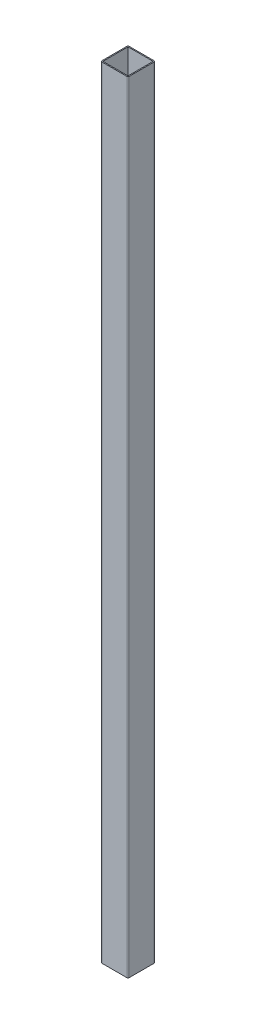
ISO-10303-21;
HEADER;
FILE_DESCRIPTION(('STEP AP214'),'2;1');
FILE_NAME('part.step','',(''),(''),'','','');
FILE_SCHEMA(('AUTOMOTIVE_DESIGN { 1 0 10303 214 1 1 1 1 }'));
ENDSEC;
DATA;
#1=APPLICATION_CONTEXT('core data for automotive mechanical design processes');
#2=APPLICATION_PROTOCOL_DEFINITION('international standard','automotive_design',2000,#1);
#3=PRODUCT_CONTEXT('',#1,'mechanical');
#4=PRODUCT('Part','Part','',(#3));
#5=PRODUCT_RELATED_PRODUCT_CATEGORY('part','',(#4));
#6=PRODUCT_DEFINITION_FORMATION('','',#4);
#7=PRODUCT_DEFINITION_CONTEXT('part definition',#1,'design');
#8=PRODUCT_DEFINITION('design','',#6,#7);
#9=PRODUCT_DEFINITION_SHAPE('','',#8);
#10=(LENGTH_UNIT() NAMED_UNIT(*) SI_UNIT(.MILLI.,.METRE.));
#11=(NAMED_UNIT(*) PLANE_ANGLE_UNIT() SI_UNIT($,.RADIAN.));
#12=(NAMED_UNIT(*) SI_UNIT($,.STERADIAN.) SOLID_ANGLE_UNIT());
#13=UNCERTAINTY_MEASURE_WITH_UNIT(LENGTH_MEASURE(1.E-05),#10,'distance_accuracy_value','');
#14=(GEOMETRIC_REPRESENTATION_CONTEXT(3) GLOBAL_UNCERTAINTY_ASSIGNED_CONTEXT((#13)) GLOBAL_UNIT_ASSIGNED_CONTEXT((#10,
#11,#12)) REPRESENTATION_CONTEXT('',''));
#15=CARTESIAN_POINT('',(0.,0.,0.));
#16=DIRECTION('',(0.,0.,1.));
#17=DIRECTION('',(1.,0.,0.));
#18=AXIS2_PLACEMENT_3D('',#15,#16,#17);
#19=CARTESIAN_POINT('',(73.9990000000006,-4593.,73.999));
#20=DIRECTION('',(0.,1.,0.));
#21=DIRECTION('',(-1.,0.,0.));
#22=AXIS2_PLACEMENT_3D('',#19,#20,#21);
#23=CYLINDRICAL_SURFACE('',#22,6.00100000000001);
#24=CARTESIAN_POINT('',(73.999,0.,73.999));
#25=DIRECTION('',(0.,-1.,0.));
#26=DIRECTION('',(1.,0.,0.));
#27=AXIS2_PLACEMENT_3D('',#24,#25,#26);
#28=CIRCLE('',#27,6.00100000000001);
#29=CARTESIAN_POINT('',(80.,0.,73.999));
#30=VERTEX_POINT('',#29);
#31=CARTESIAN_POINT('',(73.999,0.,80.));
#32=VERTEX_POINT('',#31);
#33=EDGE_CURVE('E232',#30,#32,#28,.T.);
#34=ORIENTED_EDGE('',*,*,#33,.T.);
#35=DIRECTION('',(0.,1.,0.));
#36=VECTOR('',#35,1.);
#37=CARTESIAN_POINT('',(73.9990000000006,-4593.,80.));
#38=LINE('',#37,#36);
#39=CARTESIAN_POINT('',(73.9990000000006,-4593.,80.));
#40=VERTEX_POINT('',#39);
#41=EDGE_CURVE('E12',#40,#32,#38,.T.);
#42=ORIENTED_EDGE('',*,*,#41,.F.);
#43=CARTESIAN_POINT('',(73.9990000000006,-4593.,73.999));
#44=DIRECTION('',(0.,-1.,0.));
#45=DIRECTION('',(1.,0.,0.));
#46=AXIS2_PLACEMENT_3D('',#43,#44,#45);
#47=CIRCLE('',#46,6.00100000000001);
#48=CARTESIAN_POINT('',(80.0000000000006,-4593.,73.999));
#49=VERTEX_POINT('',#48);
#50=EDGE_CURVE('E310',#49,#40,#47,.T.);
#51=ORIENTED_EDGE('',*,*,#50,.F.);
#52=DIRECTION('',(0.,1.,0.));
#53=VECTOR('',#52,1.);
#54=CARTESIAN_POINT('',(80.0000000000006,-4593.,73.999));
#55=LINE('',#54,#53);
#56=EDGE_CURVE('E247',#49,#30,#55,.T.);
#57=ORIENTED_EDGE('',*,*,#56,.T.);
#58=EDGE_LOOP('',(#34,#42,#51,#57));
#59=FACE_BOUND('',#58,.T.);
#60=ADVANCED_FACE('F60',(#59),#23,.T.);
#61=CARTESIAN_POINT('',(73.9990000000006,-4593.,80.));
#62=DIRECTION('',(0.,0.,-1.));
#63=DIRECTION('',(-1.,0.,0.));
#64=AXIS2_PLACEMENT_3D('',#61,#62,#63);
#65=PLANE('',#64);
#66=DIRECTION('',(-1.,0.,0.));
#67=VECTOR('',#66,1.);
#68=CARTESIAN_POINT('',(73.999,0.,80.));
#69=LINE('',#68,#67);
#70=CARTESIAN_POINT('',(-73.999,0.,80.));
#71=VERTEX_POINT('',#70);
#72=EDGE_CURVE('E235',#32,#71,#69,.T.);
#73=ORIENTED_EDGE('',*,*,#72,.T.);
#74=DIRECTION('',(0.,1.,0.));
#75=VECTOR('',#74,1.);
#76=CARTESIAN_POINT('',(-73.9989999999995,-4593.,80.));
#77=LINE('',#76,#75);
#78=CARTESIAN_POINT('',(-73.9989999999995,-4593.,80.));
#79=VERTEX_POINT('',#78);
#80=EDGE_CURVE('E70',#79,#71,#77,.T.);
#81=ORIENTED_EDGE('',*,*,#80,.F.);
#82=DIRECTION('',(-1.,0.,0.));
#83=VECTOR('',#82,1.);
#84=CARTESIAN_POINT('',(73.9990000000006,-4593.,80.));
#85=LINE('',#84,#83);
#86=EDGE_CURVE('E312',#40,#79,#85,.T.);
#87=ORIENTED_EDGE('',*,*,#86,.F.);
#88=ORIENTED_EDGE('',*,*,#41,.T.);
#89=EDGE_LOOP('',(#73,#81,#87,#88));
#90=FACE_BOUND('',#89,.T.);
#91=ADVANCED_FACE('F347',(#90),#65,.F.);
#92=CARTESIAN_POINT('',(-73.9989999999994,-4593.,73.999));
#93=DIRECTION('',(0.,1.,0.));
#94=DIRECTION('',(-1.,0.,0.));
#95=AXIS2_PLACEMENT_3D('',#92,#93,#94);
#96=CYLINDRICAL_SURFACE('',#95,6.00100000000001);
#97=CARTESIAN_POINT('',(-73.999,0.,73.999));
#98=DIRECTION('',(0.,-1.,0.));
#99=DIRECTION('',(1.,0.,0.));
#100=AXIS2_PLACEMENT_3D('',#97,#98,#99);
#101=CIRCLE('',#100,6.00100000000001);
#102=CARTESIAN_POINT('',(-80.,0.,73.999));
#103=VERTEX_POINT('',#102);
#104=EDGE_CURVE('E237',#71,#103,#101,.T.);
#105=ORIENTED_EDGE('',*,*,#104,.T.);
#106=DIRECTION('',(0.,1.,0.));
#107=VECTOR('',#106,1.);
#108=CARTESIAN_POINT('',(-79.9999999999994,-4593.,73.999));
#109=LINE('',#108,#107);
#110=CARTESIAN_POINT('',(-79.9999999999994,-4593.,73.999));
#111=VERTEX_POINT('',#110);
#112=EDGE_CURVE('E254',#111,#103,#109,.T.);
#113=ORIENTED_EDGE('',*,*,#112,.F.);
#114=CARTESIAN_POINT('',(-73.9989999999994,-4593.,73.999));
#115=DIRECTION('',(0.,-1.,0.));
#116=DIRECTION('',(1.,0.,0.));
#117=AXIS2_PLACEMENT_3D('',#114,#115,#116);
#118=CIRCLE('',#117,6.00100000000001);
#119=EDGE_CURVE('E314',#79,#111,#118,.T.);
#120=ORIENTED_EDGE('',*,*,#119,.F.);
#121=ORIENTED_EDGE('',*,*,#80,.T.);
#122=EDGE_LOOP('',(#105,#113,#120,#121));
#123=FACE_BOUND('',#122,.T.);
#124=ADVANCED_FACE('F352',(#123),#96,.T.);
#125=CARTESIAN_POINT('',(-79.9999999999994,-4593.,-73.999));
#126=DIRECTION('',(1.,0.,0.));
#127=DIRECTION('',(0.,1.,0.));
#128=AXIS2_PLACEMENT_3D('',#125,#126,#127);
#129=PLANE('',#128);
#130=DIRECTION('',(0.,0.,-1.));
#131=VECTOR('',#130,1.);
#132=CARTESIAN_POINT('',(-80.,0.,-73.999));
#133=LINE('',#132,#131);
#134=CARTESIAN_POINT('',(-80.,0.,-73.999));
#135=VERTEX_POINT('',#134);
#136=EDGE_CURVE('E239',#103,#135,#133,.T.);
#137=ORIENTED_EDGE('',*,*,#136,.T.);
#138=DIRECTION('',(0.,1.,0.));
#139=VECTOR('',#138,1.);
#140=CARTESIAN_POINT('',(-79.9999999999994,-4593.,-73.999));
#141=LINE('',#140,#139);
#142=CARTESIAN_POINT('',(-79.9999999999994,-4593.,-73.999));
#143=VERTEX_POINT('',#142);
#144=EDGE_CURVE('E251',#143,#135,#141,.T.);
#145=ORIENTED_EDGE('',*,*,#144,.F.);
#146=DIRECTION('',(0.,0.,-1.));
#147=VECTOR('',#146,1.);
#148=CARTESIAN_POINT('',(-79.9999999999994,-4593.,-73.999));
#149=LINE('',#148,#147);
#150=EDGE_CURVE('E316',#111,#143,#149,.T.);
#151=ORIENTED_EDGE('',*,*,#150,.F.);
#152=ORIENTED_EDGE('',*,*,#112,.T.);
#153=EDGE_LOOP('',(#137,#145,#151,#152));
#154=FACE_BOUND('',#153,.T.);
#155=ADVANCED_FACE('F322',(#154),#129,.F.);
#156=CARTESIAN_POINT('',(-73.9989999999994,-4593.,-73.999));
#157=DIRECTION('',(0.,1.,0.));
#158=DIRECTION('',(-1.,0.,0.));
#159=AXIS2_PLACEMENT_3D('',#156,#157,#158);
#160=CYLINDRICAL_SURFACE('',#159,6.001);
#161=CARTESIAN_POINT('',(-73.999,0.,-73.999));
#162=DIRECTION('',(0.,-1.,0.));
#163=DIRECTION('',(1.,0.,0.));
#164=AXIS2_PLACEMENT_3D('',#161,#162,#163);
#165=CIRCLE('',#164,6.001);
#166=CARTESIAN_POINT('',(-73.999,0.,-80.));
#167=VERTEX_POINT('',#166);
#168=EDGE_CURVE('E241',#135,#167,#165,.T.);
#169=ORIENTED_EDGE('',*,*,#168,.T.);
#170=DIRECTION('',(0.,1.,0.));
#171=VECTOR('',#170,1.);
#172=CARTESIAN_POINT('',(-73.9989999999995,-4593.,-80.));
#173=LINE('',#172,#171);
#174=CARTESIAN_POINT('',(-73.9989999999995,-4593.,-80.));
#175=VERTEX_POINT('',#174);
#176=EDGE_CURVE('E199',#175,#167,#173,.T.);
#177=ORIENTED_EDGE('',*,*,#176,.F.);
#178=CARTESIAN_POINT('',(-73.9989999999994,-4593.,-73.999));
#179=DIRECTION('',(0.,-1.,0.));
#180=DIRECTION('',(1.,0.,0.));
#181=AXIS2_PLACEMENT_3D('',#178,#179,#180);
#182=CIRCLE('',#181,6.001);
#183=EDGE_CURVE('E190',#143,#175,#182,.T.);
#184=ORIENTED_EDGE('',*,*,#183,.F.);
#185=ORIENTED_EDGE('',*,*,#144,.T.);
#186=EDGE_LOOP('',(#169,#177,#184,#185));
#187=FACE_BOUND('',#186,.T.);
#188=ADVANCED_FACE('F326',(#187),#160,.T.);
#189=CARTESIAN_POINT('',(-73.9989999999995,-4593.,-80.));
#190=DIRECTION('',(0.,0.,1.));
#191=DIRECTION('',(1.,0.,0.));
#192=AXIS2_PLACEMENT_3D('',#189,#190,#191);
#193=PLANE('',#192);
#194=DIRECTION('',(1.,0.,0.));
#195=VECTOR('',#194,1.);
#196=CARTESIAN_POINT('',(-73.999,0.,-80.));
#197=LINE('',#196,#195);
#198=CARTESIAN_POINT('',(73.999,0.,-80.));
#199=VERTEX_POINT('',#198);
#200=EDGE_CURVE('E198',#167,#199,#197,.T.);
#201=ORIENTED_EDGE('',*,*,#200,.T.);
#202=DIRECTION('',(0.,1.,0.));
#203=VECTOR('',#202,1.);
#204=CARTESIAN_POINT('',(73.9990000000006,-4593.,-80.));
#205=LINE('',#204,#203);
#206=CARTESIAN_POINT('',(73.9990000000006,-4593.,-80.));
#207=VERTEX_POINT('',#206);
#208=EDGE_CURVE('E195',#207,#199,#205,.T.);
#209=ORIENTED_EDGE('',*,*,#208,.F.);
#210=DIRECTION('',(1.,0.,0.));
#211=VECTOR('',#210,1.);
#212=CARTESIAN_POINT('',(-73.9989999999995,-4593.,-80.));
#213=LINE('',#212,#211);
#214=EDGE_CURVE('E184',#175,#207,#213,.T.);
#215=ORIENTED_EDGE('',*,*,#214,.F.);
#216=ORIENTED_EDGE('',*,*,#176,.T.);
#217=EDGE_LOOP('',(#201,#209,#215,#216));
#218=FACE_BOUND('',#217,.T.);
#219=ADVANCED_FACE('F196',(#218),#193,.F.);
#220=CARTESIAN_POINT('',(73.9990000000006,-4593.,-73.999));
#221=DIRECTION('',(0.,1.,0.));
#222=DIRECTION('',(-1.,0.,0.));
#223=AXIS2_PLACEMENT_3D('',#220,#221,#222);
#224=CYLINDRICAL_SURFACE('',#223,6.001);
#225=CARTESIAN_POINT('',(73.999,0.,-73.999));
#226=DIRECTION('',(0.,-1.,0.));
#227=DIRECTION('',(1.,0.,0.));
#228=AXIS2_PLACEMENT_3D('',#225,#226,#227);
#229=CIRCLE('',#228,6.001);
#230=CARTESIAN_POINT('',(80.,0.,-73.999));
#231=VERTEX_POINT('',#230);
#232=EDGE_CURVE('E132',#199,#231,#229,.T.);
#233=ORIENTED_EDGE('',*,*,#232,.T.);
#234=DIRECTION('',(0.,1.,0.));
#235=VECTOR('',#234,1.);
#236=CARTESIAN_POINT('',(80.0000000000006,-4593.,-73.999));
#237=LINE('',#236,#235);
#238=CARTESIAN_POINT('',(80.0000000000006,-4593.,-73.999));
#239=VERTEX_POINT('',#238);
#240=EDGE_CURVE('E200',#239,#231,#237,.T.);
#241=ORIENTED_EDGE('',*,*,#240,.F.);
#242=CARTESIAN_POINT('',(73.9990000000006,-4593.,-73.999));
#243=DIRECTION('',(0.,-1.,0.));
#244=DIRECTION('',(1.,0.,0.));
#245=AXIS2_PLACEMENT_3D('',#242,#243,#244);
#246=CIRCLE('',#245,6.001);
#247=EDGE_CURVE('E188',#207,#239,#246,.T.);
#248=ORIENTED_EDGE('',*,*,#247,.F.);
#249=ORIENTED_EDGE('',*,*,#208,.T.);
#250=EDGE_LOOP('',(#233,#241,#248,#249));
#251=FACE_BOUND('',#250,.T.);
#252=ADVANCED_FACE('F202',(#251),#224,.T.);
#253=CARTESIAN_POINT('',(-73.9989999999994,-4593.,73.999));
#254=DIRECTION('',(0.,1.,0.));
#255=DIRECTION('',(-1.,0.,0.));
#256=AXIS2_PLACEMENT_3D('',#253,#254,#255);
#257=CYLINDRICAL_SURFACE('',#256,0.000999999999987122);
#258=CARTESIAN_POINT('',(-73.999,0.,73.999));
#259=DIRECTION('',(0.,-1.,0.));
#260=DIRECTION('',(1.,0.,0.));
#261=AXIS2_PLACEMENT_3D('',#258,#259,#260);
#262=CIRCLE('',#261,0.000999999999987122);
#263=CARTESIAN_POINT('',(-73.999,0.,74.));
#264=VERTEX_POINT('',#263);
#265=CARTESIAN_POINT('',(-74.,0.,73.999));
#266=VERTEX_POINT('',#265);
#267=EDGE_CURVE('E208',#264,#266,#262,.T.);
#268=ORIENTED_EDGE('',*,*,#267,.F.);
#269=DIRECTION('',(0.,1.,0.));
#270=VECTOR('',#269,1.);
#271=CARTESIAN_POINT('',(-73.9989999999994,-4593.,74.));
#272=LINE('',#271,#270);
#273=CARTESIAN_POINT('',(-73.9989999999994,-4593.,74.));
#274=VERTEX_POINT('',#273);
#275=EDGE_CURVE('E64',#274,#264,#272,.T.);
#276=ORIENTED_EDGE('',*,*,#275,.F.);
#277=CARTESIAN_POINT('',(-73.9989999999994,-4593.,73.999));
#278=DIRECTION('',(0.,-1.,0.));
#279=DIRECTION('',(1.,0.,0.));
#280=AXIS2_PLACEMENT_3D('',#277,#278,#279);
#281=CIRCLE('',#280,0.000999999999987122);
#282=CARTESIAN_POINT('',(-73.9999999999994,-4593.,73.999));
#283=VERTEX_POINT('',#282);
#284=EDGE_CURVE('E246',#274,#283,#281,.T.);
#285=ORIENTED_EDGE('',*,*,#284,.T.);
#286=DIRECTION('',(0.,1.,0.));
#287=VECTOR('',#286,1.);
#288=CARTESIAN_POINT('',(-73.9999999999994,-4593.,73.999));
#289=LINE('',#288,#287);
#290=EDGE_CURVE('E204',#283,#266,#289,.T.);
#291=ORIENTED_EDGE('',*,*,#290,.T.);
#292=EDGE_LOOP('',(#268,#276,#285,#291));
#293=FACE_BOUND('',#292,.T.);
#294=ADVANCED_FACE('F62',(#293),#257,.F.);
#295=CARTESIAN_POINT('',(73.9990000000006,-4593.,74.));
#296=DIRECTION('',(0.,0.,-1.));
#297=DIRECTION('',(-1.,0.,0.));
#298=AXIS2_PLACEMENT_3D('',#295,#296,#297);
#299=PLANE('',#298);
#300=DIRECTION('',(-1.,0.,0.));
#301=VECTOR('',#300,1.);
#302=CARTESIAN_POINT('',(73.999,0.,74.));
#303=LINE('',#302,#301);
#304=CARTESIAN_POINT('',(73.999,0.,74.));
#305=VERTEX_POINT('',#304);
#306=EDGE_CURVE('E211',#305,#264,#303,.T.);
#307=ORIENTED_EDGE('',*,*,#306,.F.);
#308=DIRECTION('',(0.,1.,0.));
#309=VECTOR('',#308,1.);
#310=CARTESIAN_POINT('',(73.9990000000006,-4593.,74.));
#311=LINE('',#310,#309);
#312=CARTESIAN_POINT('',(73.9990000000006,-4593.,74.));
#313=VERTEX_POINT('',#312);
#314=EDGE_CURVE('E269',#313,#305,#311,.T.);
#315=ORIENTED_EDGE('',*,*,#314,.F.);
#316=DIRECTION('',(-1.,0.,0.));
#317=VECTOR('',#316,1.);
#318=CARTESIAN_POINT('',(73.9990000000006,-4593.,74.));
#319=LINE('',#318,#317);
#320=EDGE_CURVE('E278',#313,#274,#319,.T.);
#321=ORIENTED_EDGE('',*,*,#320,.T.);
#322=ORIENTED_EDGE('',*,*,#275,.T.);
#323=EDGE_LOOP('',(#307,#315,#321,#322));
#324=FACE_BOUND('',#323,.T.);
#325=ADVANCED_FACE('F276',(#324),#299,.T.);
#326=CARTESIAN_POINT('',(73.9990000000006,-4593.,73.999));
#327=DIRECTION('',(0.,1.,0.));
#328=DIRECTION('',(-1.,0.,0.));
#329=AXIS2_PLACEMENT_3D('',#326,#327,#328);
#330=CYLINDRICAL_SURFACE('',#329,0.000999999999987122);
#331=CARTESIAN_POINT('',(73.999,0.,73.999));
#332=DIRECTION('',(0.,-1.,0.));
#333=DIRECTION('',(1.,0.,0.));
#334=AXIS2_PLACEMENT_3D('',#331,#332,#333);
#335=CIRCLE('',#334,0.000999999999987122);
#336=CARTESIAN_POINT('',(74.,0.,73.999));
#337=VERTEX_POINT('',#336);
#338=EDGE_CURVE('E214',#337,#305,#335,.T.);
#339=ORIENTED_EDGE('',*,*,#338,.F.);
#340=DIRECTION('',(0.,1.,0.));
#341=VECTOR('',#340,1.);
#342=CARTESIAN_POINT('',(74.0000000000006,-4593.,73.999));
#343=LINE('',#342,#341);
#344=CARTESIAN_POINT('',(74.0000000000006,-4593.,73.999));
#345=VERTEX_POINT('',#344);
#346=EDGE_CURVE('E268',#345,#337,#343,.T.);
#347=ORIENTED_EDGE('',*,*,#346,.F.);
#348=CARTESIAN_POINT('',(73.9990000000006,-4593.,73.999));
#349=DIRECTION('',(0.,-1.,0.));
#350=DIRECTION('',(1.,0.,0.));
#351=AXIS2_PLACEMENT_3D('',#348,#349,#350);
#352=CIRCLE('',#351,0.000999999999987122);
#353=EDGE_CURVE('E286',#345,#313,#352,.T.);
#354=ORIENTED_EDGE('',*,*,#353,.T.);
#355=ORIENTED_EDGE('',*,*,#314,.T.);
#356=EDGE_LOOP('',(#339,#347,#354,#355));
#357=FACE_BOUND('',#356,.T.);
#358=ADVANCED_FACE('F284',(#357),#330,.F.);
#359=CARTESIAN_POINT('',(74.0000000000006,-4593.,73.999));
#360=DIRECTION('',(-1.,0.,0.));
#361=DIRECTION('',(0.,-1.,0.));
#362=AXIS2_PLACEMENT_3D('',#359,#360,#361);
#363=PLANE('',#362);
#364=DIRECTION('',(0.,0.,1.));
#365=VECTOR('',#364,1.);
#366=CARTESIAN_POINT('',(74.,0.,73.999));
#367=LINE('',#366,#365);
#368=CARTESIAN_POINT('',(74.,0.,-73.999));
#369=VERTEX_POINT('',#368);
#370=EDGE_CURVE('E217',#369,#337,#367,.T.);
#371=ORIENTED_EDGE('',*,*,#370,.F.);
#372=DIRECTION('',(0.,1.,0.));
#373=VECTOR('',#372,1.);
#374=CARTESIAN_POINT('',(74.0000000000006,-4593.,-73.999));
#375=LINE('',#374,#373);
#376=CARTESIAN_POINT('',(74.0000000000006,-4593.,-73.999));
#377=VERTEX_POINT('',#376);
#378=EDGE_CURVE('E266',#377,#369,#375,.T.);
#379=ORIENTED_EDGE('',*,*,#378,.F.);
#380=DIRECTION('',(0.,0.,1.));
#381=VECTOR('',#380,1.);
#382=CARTESIAN_POINT('',(74.0000000000006,-4593.,73.999));
#383=LINE('',#382,#381);
#384=EDGE_CURVE('E292',#377,#345,#383,.T.);
#385=ORIENTED_EDGE('',*,*,#384,.T.);
#386=ORIENTED_EDGE('',*,*,#346,.T.);
#387=EDGE_LOOP('',(#371,#379,#385,#386));
#388=FACE_BOUND('',#387,.T.);
#389=ADVANCED_FACE('F295',(#388),#363,.T.);
#390=CARTESIAN_POINT('',(73.9990000000006,-4593.,-73.999));
#391=DIRECTION('',(0.,1.,0.));
#392=DIRECTION('',(-1.,0.,0.));
#393=AXIS2_PLACEMENT_3D('',#390,#391,#392);
#394=CYLINDRICAL_SURFACE('',#393,0.000999999999980183);
#395=CARTESIAN_POINT('',(73.999,0.,-73.999));
#396=DIRECTION('',(0.,-1.,0.));
#397=DIRECTION('',(1.,0.,0.));
#398=AXIS2_PLACEMENT_3D('',#395,#396,#397);
#399=CIRCLE('',#398,0.000999999999980183);
#400=CARTESIAN_POINT('',(73.999,0.,-74.));
#401=VERTEX_POINT('',#400);
#402=EDGE_CURVE('E220',#401,#369,#399,.T.);
#403=ORIENTED_EDGE('',*,*,#402,.F.);
#404=DIRECTION('',(0.,1.,0.));
#405=VECTOR('',#404,1.);
#406=CARTESIAN_POINT('',(73.9990000000006,-4593.,-74.));
#407=LINE('',#406,#405);
#408=CARTESIAN_POINT('',(73.9990000000006,-4593.,-74.));
#409=VERTEX_POINT('',#408);
#410=EDGE_CURVE('E264',#409,#401,#407,.T.);
#411=ORIENTED_EDGE('',*,*,#410,.F.);
#412=CARTESIAN_POINT('',(73.9990000000006,-4593.,-73.999));
#413=DIRECTION('',(0.,-1.,0.));
#414=DIRECTION('',(1.,0.,0.));
#415=AXIS2_PLACEMENT_3D('',#412,#413,#414);
#416=CIRCLE('',#415,0.000999999999980183);
#417=EDGE_CURVE('E296',#409,#377,#416,.T.);
#418=ORIENTED_EDGE('',*,*,#417,.T.);
#419=ORIENTED_EDGE('',*,*,#378,.T.);
#420=EDGE_LOOP('',(#403,#411,#418,#419));
#421=FACE_BOUND('',#420,.T.);
#422=ADVANCED_FACE('F363',(#421),#394,.F.);
#423=CARTESIAN_POINT('',(-73.9989999999994,-4593.,-74.));
#424=DIRECTION('',(0.,0.,1.));
#425=DIRECTION('',(1.,0.,0.));
#426=AXIS2_PLACEMENT_3D('',#423,#424,#425);
#427=PLANE('',#426);
#428=DIRECTION('',(1.,0.,0.));
#429=VECTOR('',#428,1.);
#430=CARTESIAN_POINT('',(-73.999,0.,-74.));
#431=LINE('',#430,#429);
#432=CARTESIAN_POINT('',(-73.999,0.,-74.));
#433=VERTEX_POINT('',#432);
#434=EDGE_CURVE('E223',#433,#401,#431,.T.);
#435=ORIENTED_EDGE('',*,*,#434,.F.);
#436=DIRECTION('',(0.,1.,0.));
#437=VECTOR('',#436,1.);
#438=CARTESIAN_POINT('',(-73.9989999999994,-4593.,-74.));
#439=LINE('',#438,#437);
#440=CARTESIAN_POINT('',(-73.9989999999994,-4593.,-74.));
#441=VERTEX_POINT('',#440);
#442=EDGE_CURVE('E262',#441,#433,#439,.T.);
#443=ORIENTED_EDGE('',*,*,#442,.F.);
#444=DIRECTION('',(1.,0.,0.));
#445=VECTOR('',#444,1.);
#446=CARTESIAN_POINT('',(-73.9989999999994,-4593.,-74.));
#447=LINE('',#446,#445);
#448=EDGE_CURVE('E298',#441,#409,#447,.T.);
#449=ORIENTED_EDGE('',*,*,#448,.T.);
#450=ORIENTED_EDGE('',*,*,#410,.T.);
#451=EDGE_LOOP('',(#435,#443,#449,#450));
#452=FACE_BOUND('',#451,.T.);
#453=ADVANCED_FACE('F359',(#452),#427,.T.);
#454=CARTESIAN_POINT('',(-73.9989999999994,-4593.,-73.999));
#455=DIRECTION('',(0.,1.,0.));
#456=DIRECTION('',(-1.,0.,0.));
#457=AXIS2_PLACEMENT_3D('',#454,#455,#456);
#458=CYLINDRICAL_SURFACE('',#457,0.000999999999980183);
#459=CARTESIAN_POINT('',(-73.999,0.,-73.999));
#460=DIRECTION('',(0.,-1.,0.));
#461=DIRECTION('',(1.,0.,0.));
#462=AXIS2_PLACEMENT_3D('',#459,#460,#461);
#463=CIRCLE('',#462,0.000999999999980183);
#464=CARTESIAN_POINT('',(-74.,0.,-73.999));
#465=VERTEX_POINT('',#464);
#466=EDGE_CURVE('E226',#465,#433,#463,.T.);
#467=ORIENTED_EDGE('',*,*,#466,.F.);
#468=DIRECTION('',(0.,1.,0.));
#469=VECTOR('',#468,1.);
#470=CARTESIAN_POINT('',(-73.9999999999994,-4593.,-73.999));
#471=LINE('',#470,#469);
#472=CARTESIAN_POINT('',(-73.9999999999994,-4593.,-73.999));
#473=VERTEX_POINT('',#472);
#474=EDGE_CURVE('E260',#473,#465,#471,.T.);
#475=ORIENTED_EDGE('',*,*,#474,.F.);
#476=CARTESIAN_POINT('',(-73.9989999999994,-4593.,-73.999));
#477=DIRECTION('',(0.,-1.,0.));
#478=DIRECTION('',(1.,0.,0.));
#479=AXIS2_PLACEMENT_3D('',#476,#477,#478);
#480=CIRCLE('',#479,0.000999999999980183);
#481=EDGE_CURVE('E304',#473,#441,#480,.T.);
#482=ORIENTED_EDGE('',*,*,#481,.T.);
#483=ORIENTED_EDGE('',*,*,#442,.T.);
#484=EDGE_LOOP('',(#467,#475,#482,#483));
#485=FACE_BOUND('',#484,.T.);
#486=ADVANCED_FACE('F341',(#485),#458,.F.);
#487=CARTESIAN_POINT('',(-73.9999999999994,-4593.,-73.999));
#488=DIRECTION('',(1.,0.,0.));
#489=DIRECTION('',(0.,1.,0.));
#490=AXIS2_PLACEMENT_3D('',#487,#488,#489);
#491=PLANE('',#490);
#492=DIRECTION('',(0.,0.,-1.));
#493=VECTOR('',#492,1.);
#494=CARTESIAN_POINT('',(-74.,0.,-73.999));
#495=LINE('',#494,#493);
#496=EDGE_CURVE('E229',#266,#465,#495,.T.);
#497=ORIENTED_EDGE('',*,*,#496,.F.);
#498=ORIENTED_EDGE('',*,*,#290,.F.);
#499=DIRECTION('',(0.,0.,-1.));
#500=VECTOR('',#499,1.);
#501=CARTESIAN_POINT('',(-73.9999999999994,-4593.,-73.999));
#502=LINE('',#501,#500);
#503=EDGE_CURVE('E307',#283,#473,#502,.T.);
#504=ORIENTED_EDGE('',*,*,#503,.T.);
#505=ORIENTED_EDGE('',*,*,#474,.T.);
#506=EDGE_LOOP('',(#497,#498,#504,#505));
#507=FACE_BOUND('',#506,.T.);
#508=ADVANCED_FACE('F334',(#507),#491,.T.);
#509=CARTESIAN_POINT('',(80.0000000000006,-4593.,73.999));
#510=DIRECTION('',(-1.,0.,0.));
#511=DIRECTION('',(0.,-1.,0.));
#512=AXIS2_PLACEMENT_3D('',#509,#510,#511);
#513=PLANE('',#512);
#514=DIRECTION('',(0.,0.,1.));
#515=VECTOR('',#514,1.);
#516=CARTESIAN_POINT('',(80.,0.,73.999));
#517=LINE('',#516,#515);
#518=EDGE_CURVE('E138',#231,#30,#517,.T.);
#519=ORIENTED_EDGE('',*,*,#518,.T.);
#520=ORIENTED_EDGE('',*,*,#56,.F.);
#521=DIRECTION('',(0.,0.,1.));
#522=VECTOR('',#521,1.);
#523=CARTESIAN_POINT('',(80.0000000000006,-4593.,73.999));
#524=LINE('',#523,#522);
#525=EDGE_CURVE('E79',#239,#49,#524,.T.);
#526=ORIENTED_EDGE('',*,*,#525,.F.);
#527=ORIENTED_EDGE('',*,*,#240,.T.);
#528=EDGE_LOOP('',(#519,#520,#526,#527));
#529=FACE_BOUND('',#528,.T.);
#530=ADVANCED_FACE('F332',(#529),#513,.F.);
#531=CARTESIAN_POINT('',(73.9990000000006,-4593.,73.999));
#532=DIRECTION('',(0.,-1.,0.));
#533=DIRECTION('',(1.,0.,0.));
#534=AXIS2_PLACEMENT_3D('',#531,#532,#533);
#535=PLANE('',#534);
#536=ORIENTED_EDGE('',*,*,#284,.F.);
#537=ORIENTED_EDGE('',*,*,#320,.F.);
#538=ORIENTED_EDGE('',*,*,#353,.F.);
#539=ORIENTED_EDGE('',*,*,#384,.F.);
#540=ORIENTED_EDGE('',*,*,#417,.F.);
#541=ORIENTED_EDGE('',*,*,#448,.F.);
#542=ORIENTED_EDGE('',*,*,#481,.F.);
#543=ORIENTED_EDGE('',*,*,#503,.F.);
#544=EDGE_LOOP('',(#536,#537,#538,#539,#540,#541,#542,#543));
#545=FACE_BOUND('',#544,.T.);
#546=ORIENTED_EDGE('',*,*,#50,.T.);
#547=ORIENTED_EDGE('',*,*,#86,.T.);
#548=ORIENTED_EDGE('',*,*,#119,.T.);
#549=ORIENTED_EDGE('',*,*,#150,.T.);
#550=ORIENTED_EDGE('',*,*,#183,.T.);
#551=ORIENTED_EDGE('',*,*,#214,.T.);
#552=ORIENTED_EDGE('',*,*,#247,.T.);
#553=ORIENTED_EDGE('',*,*,#525,.T.);
#554=EDGE_LOOP('',(#546,#547,#548,#549,#550,#551,#552,#553));
#555=FACE_BOUND('',#554,.T.);
#556=ADVANCED_FACE('F186',(#545,#555),#535,.T.);
#557=CARTESIAN_POINT('',(73.999,0.,73.999));
#558=DIRECTION('',(0.,-1.,0.));
#559=DIRECTION('',(1.,0.,0.));
#560=AXIS2_PLACEMENT_3D('',#557,#558,#559);
#561=PLANE('',#560);
#562=ORIENTED_EDGE('',*,*,#267,.T.);
#563=ORIENTED_EDGE('',*,*,#496,.T.);
#564=ORIENTED_EDGE('',*,*,#466,.T.);
#565=ORIENTED_EDGE('',*,*,#434,.T.);
#566=ORIENTED_EDGE('',*,*,#402,.T.);
#567=ORIENTED_EDGE('',*,*,#370,.T.);
#568=ORIENTED_EDGE('',*,*,#338,.T.);
#569=ORIENTED_EDGE('',*,*,#306,.T.);
#570=EDGE_LOOP('',(#562,#563,#564,#565,#566,#567,#568,#569));
#571=FACE_BOUND('',#570,.T.);
#572=ORIENTED_EDGE('',*,*,#33,.F.);
#573=ORIENTED_EDGE('',*,*,#518,.F.);
#574=ORIENTED_EDGE('',*,*,#232,.F.);
#575=ORIENTED_EDGE('',*,*,#200,.F.);
#576=ORIENTED_EDGE('',*,*,#168,.F.);
#577=ORIENTED_EDGE('',*,*,#136,.F.);
#578=ORIENTED_EDGE('',*,*,#104,.F.);
#579=ORIENTED_EDGE('',*,*,#72,.F.);
#580=EDGE_LOOP('',(#572,#573,#574,#575,#576,#577,#578,#579));
#581=FACE_BOUND('',#580,.T.);
#582=ADVANCED_FACE('F281',(#571,#581),#561,.F.);
#583=CLOSED_SHELL('',(#60,#91,#124,#155,#188,#219,#252,#294,#325,#358,#389,#422,#453,#486,#508,
#530,#556,#582));
#584=MANIFOLD_SOLID_BREP('B2',#583);
#585=ADVANCED_BREP_SHAPE_REPRESENTATION('',(#18,#584),#14);
#586=SHAPE_DEFINITION_REPRESENTATION(#9,#585);
ENDSEC;
END-ISO-10303-21;
